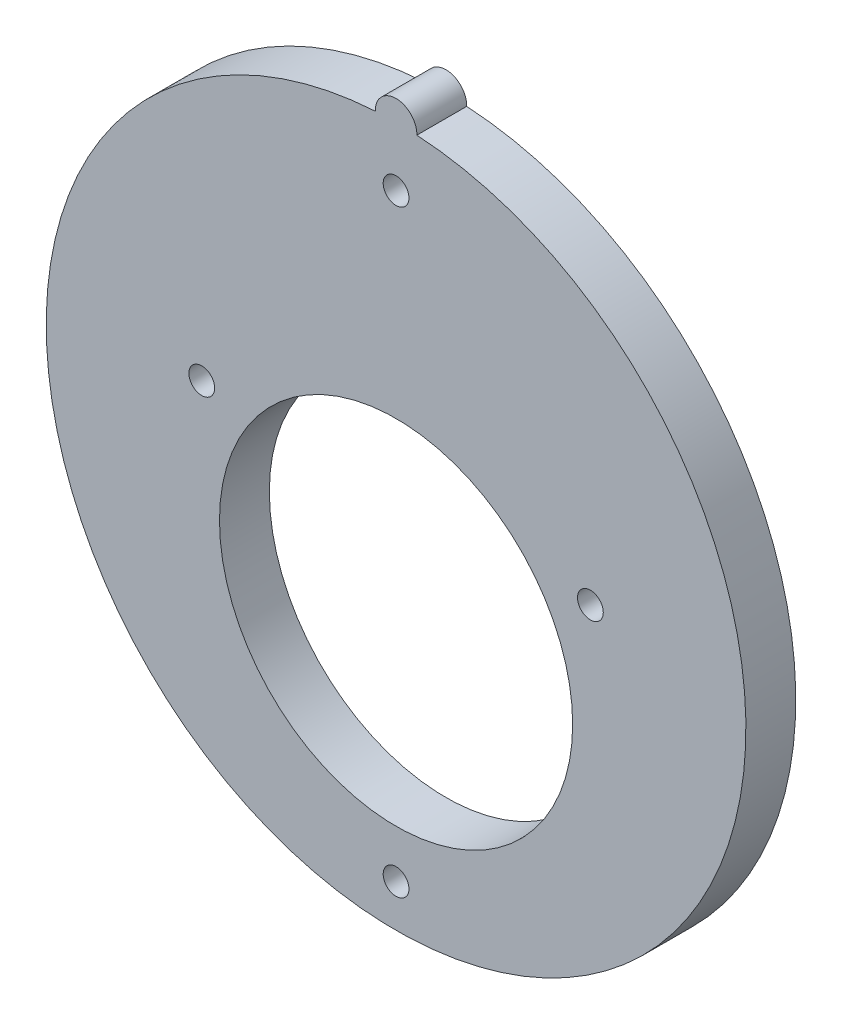
ISO-10303-21;
HEADER;
FILE_DESCRIPTION(('STEP AP214'),'2;1');
FILE_NAME('part.step','',(''),(''),'','','');
FILE_SCHEMA(('AUTOMOTIVE_DESIGN { 1 0 10303 214 1 1 1 1 }'));
ENDSEC;
DATA;
#1=APPLICATION_CONTEXT('core data for automotive mechanical design processes');
#2=APPLICATION_PROTOCOL_DEFINITION('international standard','automotive_design',2000,#1);
#3=PRODUCT_CONTEXT('',#1,'mechanical');
#4=PRODUCT('Part','Part','',(#3));
#5=PRODUCT_RELATED_PRODUCT_CATEGORY('part','',(#4));
#6=PRODUCT_DEFINITION_FORMATION('','',#4);
#7=PRODUCT_DEFINITION_CONTEXT('part definition',#1,'design');
#8=PRODUCT_DEFINITION('design','',#6,#7);
#9=PRODUCT_DEFINITION_SHAPE('','',#8);
#10=(LENGTH_UNIT() NAMED_UNIT(*) SI_UNIT(.MILLI.,.METRE.));
#11=(NAMED_UNIT(*) PLANE_ANGLE_UNIT() SI_UNIT($,.RADIAN.));
#12=(NAMED_UNIT(*) SI_UNIT($,.STERADIAN.) SOLID_ANGLE_UNIT());
#13=UNCERTAINTY_MEASURE_WITH_UNIT(LENGTH_MEASURE(1.E-05),#10,'distance_accuracy_value','');
#14=(GEOMETRIC_REPRESENTATION_CONTEXT(3) GLOBAL_UNCERTAINTY_ASSIGNED_CONTEXT((#13)) GLOBAL_UNIT_ASSIGNED_CONTEXT((#10,
#11,#12)) REPRESENTATION_CONTEXT('',''));
#15=CARTESIAN_POINT('',(0.,0.,0.));
#16=DIRECTION('',(0.,0.,1.));
#17=DIRECTION('',(1.,0.,0.));
#18=AXIS2_PLACEMENT_3D('',#15,#16,#17);
#19=CARTESIAN_POINT('',(41.2795138079787,73.9819791796727,6.));
#20=DIRECTION('',(0.,0.,-1.));
#21=DIRECTION('',(-1.,0.,0.));
#22=AXIS2_PLACEMENT_3D('',#19,#20,#21);
#23=CYLINDRICAL_SURFACE('',#22,2.5);
#24=CARTESIAN_POINT('',(41.2795138079787,73.9819791796727,0.));
#25=DIRECTION('',(0.,0.,1.));
#26=DIRECTION('',(1.,0.,0.));
#27=AXIS2_PLACEMENT_3D('',#24,#25,#26);
#28=CIRCLE('',#27,2.5);
#29=CARTESIAN_POINT('',(43.7784116049653,73.9077511511692,0.));
#30=VERTEX_POINT('',#29);
#31=CARTESIAN_POINT('',(38.7806160109921,73.9077511511692,0.));
#32=VERTEX_POINT('',#31);
#33=EDGE_CURVE('E67',#30,#32,#28,.T.);
#34=ORIENTED_EDGE('',*,*,#33,.T.);
#35=DIRECTION('',(0.,0.,-1.));
#36=VECTOR('',#35,1.);
#37=CARTESIAN_POINT('',(38.7806160109921,73.9077511511692,6.));
#38=LINE('',#37,#36);
#39=CARTESIAN_POINT('',(38.7806160109921,73.9077511511692,6.));
#40=VERTEX_POINT('',#39);
#41=EDGE_CURVE('E11',#40,#32,#38,.T.);
#42=ORIENTED_EDGE('',*,*,#41,.F.);
#43=CARTESIAN_POINT('',(41.2795138079787,73.9819791796727,6.));
#44=DIRECTION('',(0.,0.,1.));
#45=DIRECTION('',(1.,0.,0.));
#46=AXIS2_PLACEMENT_3D('',#43,#44,#45);
#47=CIRCLE('',#46,2.5);
#48=CARTESIAN_POINT('',(43.7784116049653,73.9077511511692,6.));
#49=VERTEX_POINT('',#48);
#50=EDGE_CURVE('E66',#49,#40,#47,.T.);
#51=ORIENTED_EDGE('',*,*,#50,.F.);
#52=DIRECTION('',(0.,0.,-1.));
#53=VECTOR('',#52,1.);
#54=CARTESIAN_POINT('',(43.7784116049653,73.9077511511692,6.));
#55=LINE('',#54,#53);
#56=EDGE_CURVE('E43',#49,#30,#55,.T.);
#57=ORIENTED_EDGE('',*,*,#56,.T.);
#58=EDGE_LOOP('',(#34,#42,#51,#57));
#59=FACE_BOUND('',#58,.T.);
#60=ADVANCED_FACE('F34',(#59),#23,.T.);
#61=CARTESIAN_POINT('',(41.2795138079787,31.8819791796727,6.));
#62=DIRECTION('',(0.,0.,-1.));
#63=DIRECTION('',(-1.,0.,0.));
#64=AXIS2_PLACEMENT_3D('',#61,#62,#63);
#65=CYLINDRICAL_SURFACE('',#64,42.1);
#66=CARTESIAN_POINT('',(41.2795138079787,31.8819791796727,0.));
#67=DIRECTION('',(0.,0.,1.));
#68=DIRECTION('',(1.,0.,0.));
#69=AXIS2_PLACEMENT_3D('',#66,#67,#68);
#70=CIRCLE('',#69,42.1);
#71=EDGE_CURVE('E59',#32,#30,#70,.T.);
#72=ORIENTED_EDGE('',*,*,#71,.T.);
#73=ORIENTED_EDGE('',*,*,#56,.F.);
#74=CARTESIAN_POINT('',(41.2795138079787,31.8819791796727,6.));
#75=DIRECTION('',(0.,0.,1.));
#76=DIRECTION('',(1.,0.,0.));
#77=AXIS2_PLACEMENT_3D('',#74,#75,#76);
#78=CIRCLE('',#77,42.1);
#79=EDGE_CURVE('E51',#40,#49,#78,.T.);
#80=ORIENTED_EDGE('',*,*,#79,.F.);
#81=ORIENTED_EDGE('',*,*,#41,.T.);
#82=EDGE_LOOP('',(#72,#73,#80,#81));
#83=FACE_BOUND('',#82,.T.);
#84=ADVANCED_FACE('F62',(#83),#65,.T.);
#85=CARTESIAN_POINT('',(41.2795138079787,52.9319791796727,6.));
#86=DIRECTION('',(0.,0.,1.));
#87=DIRECTION('',(1.,0.,0.));
#88=AXIS2_PLACEMENT_3D('',#85,#86,#87);
#89=PLANE('',#88);
#90=CARTESIAN_POINT('',(41.2795138079787,66.8819791796727,6.));
#91=DIRECTION('',(0.,0.,1.));
#92=DIRECTION('',(1.,0.,0.));
#93=AXIS2_PLACEMENT_3D('',#90,#91,#92);
#94=CIRCLE('',#93,1.55);
#95=CARTESIAN_POINT('',(42.8295138079787,66.8819791796727,6.));
#96=VERTEX_POINT('',#95);
#97=EDGE_CURVE('E99',#96,#96,#94,.T.);
#98=ORIENTED_EDGE('',*,*,#97,.F.);
#99=EDGE_LOOP('',(#98));
#100=FACE_BOUND('',#99,.T.);
#101=CARTESIAN_POINT('',(64.6621997101586,35.3819791796727,6.));
#102=DIRECTION('',(0.,0.,1.));
#103=DIRECTION('',(1.,0.,0.));
#104=AXIS2_PLACEMENT_3D('',#101,#102,#103);
#105=CIRCLE('',#104,1.54999999999999);
#106=CARTESIAN_POINT('',(66.2121997101586,35.3819791796727,6.));
#107=VERTEX_POINT('',#106);
#108=EDGE_CURVE('E89',#107,#107,#105,.T.);
#109=ORIENTED_EDGE('',*,*,#108,.F.);
#110=EDGE_LOOP('',(#109));
#111=FACE_BOUND('',#110,.T.);
#112=CARTESIAN_POINT('',(17.8968279057989,35.3819791796728,6.));
#113=DIRECTION('',(0.,0.,1.));
#114=DIRECTION('',(1.,0.,0.));
#115=AXIS2_PLACEMENT_3D('',#112,#113,#114);
#116=CIRCLE('',#115,1.55);
#117=CARTESIAN_POINT('',(19.4468279057989,35.3819791796728,6.));
#118=VERTEX_POINT('',#117);
#119=EDGE_CURVE('E86',#118,#118,#116,.T.);
#120=ORIENTED_EDGE('',*,*,#119,.F.);
#121=EDGE_LOOP('',(#120));
#122=FACE_BOUND('',#121,.T.);
#123=CARTESIAN_POINT('',(41.2795138079787,-5.11802082032728,6.));
#124=DIRECTION('',(0.,0.,1.));
#125=DIRECTION('',(1.,0.,0.));
#126=AXIS2_PLACEMENT_3D('',#123,#124,#125);
#127=CIRCLE('',#126,1.55);
#128=CARTESIAN_POINT('',(42.8295138079787,-5.11802082032728,6.));
#129=VERTEX_POINT('',#128);
#130=EDGE_CURVE('E83',#129,#129,#127,.T.);
#131=ORIENTED_EDGE('',*,*,#130,.F.);
#132=EDGE_LOOP('',(#131));
#133=FACE_BOUND('',#132,.T.);
#134=CARTESIAN_POINT('',(41.2795138079787,21.8819791796727,6.));
#135=DIRECTION('',(0.,0.,1.));
#136=DIRECTION('',(1.,0.,0.));
#137=AXIS2_PLACEMENT_3D('',#134,#135,#136);
#138=CIRCLE('',#137,21.25);
#139=CARTESIAN_POINT('',(62.5295138079787,21.8819791796727,6.));
#140=VERTEX_POINT('',#139);
#141=EDGE_CURVE('E75',#140,#140,#138,.T.);
#142=ORIENTED_EDGE('',*,*,#141,.F.);
#143=EDGE_LOOP('',(#142));
#144=FACE_BOUND('',#143,.T.);
#145=ORIENTED_EDGE('',*,*,#50,.T.);
#146=ORIENTED_EDGE('',*,*,#79,.T.);
#147=EDGE_LOOP('',(#145,#146));
#148=FACE_BOUND('',#147,.T.);
#149=ADVANCED_FACE('F105',(#100,#111,#122,#133,#144,#148),#89,.T.);
#150=CARTESIAN_POINT('',(41.2795138079787,52.9319791796727,0.));
#151=DIRECTION('',(0.,0.,1.));
#152=DIRECTION('',(1.,0.,0.));
#153=AXIS2_PLACEMENT_3D('',#150,#151,#152);
#154=PLANE('',#153);
#155=CARTESIAN_POINT('',(41.2795138079787,66.8819791796727,0.));
#156=DIRECTION('',(0.,0.,1.));
#157=DIRECTION('',(1.,0.,0.));
#158=AXIS2_PLACEMENT_3D('',#155,#156,#157);
#159=CIRCLE('',#158,1.55);
#160=CARTESIAN_POINT('',(42.8295138079787,66.8819791796727,0.));
#161=VERTEX_POINT('',#160);
#162=EDGE_CURVE('E37',#161,#161,#159,.T.);
#163=ORIENTED_EDGE('',*,*,#162,.T.);
#164=EDGE_LOOP('',(#163));
#165=FACE_BOUND('',#164,.T.);
#166=CARTESIAN_POINT('',(64.6621997101586,35.3819791796727,0.));
#167=DIRECTION('',(0.,0.,1.));
#168=DIRECTION('',(1.,0.,0.));
#169=AXIS2_PLACEMENT_3D('',#166,#167,#168);
#170=CIRCLE('',#169,1.54999999999999);
#171=CARTESIAN_POINT('',(66.2121997101586,35.3819791796727,0.));
#172=VERTEX_POINT('',#171);
#173=EDGE_CURVE('E87',#172,#172,#170,.T.);
#174=ORIENTED_EDGE('',*,*,#173,.T.);
#175=EDGE_LOOP('',(#174));
#176=FACE_BOUND('',#175,.T.);
#177=CARTESIAN_POINT('',(17.8968279057989,35.3819791796728,0.));
#178=DIRECTION('',(0.,0.,1.));
#179=DIRECTION('',(1.,0.,0.));
#180=AXIS2_PLACEMENT_3D('',#177,#178,#179);
#181=CIRCLE('',#180,1.55);
#182=CARTESIAN_POINT('',(19.4468279057989,35.3819791796728,0.));
#183=VERTEX_POINT('',#182);
#184=EDGE_CURVE('E84',#183,#183,#181,.T.);
#185=ORIENTED_EDGE('',*,*,#184,.T.);
#186=EDGE_LOOP('',(#185));
#187=FACE_BOUND('',#186,.T.);
#188=CARTESIAN_POINT('',(41.2795138079787,-5.11802082032728,0.));
#189=DIRECTION('',(0.,0.,1.));
#190=DIRECTION('',(1.,0.,0.));
#191=AXIS2_PLACEMENT_3D('',#188,#189,#190);
#192=CIRCLE('',#191,1.55);
#193=CARTESIAN_POINT('',(42.8295138079787,-5.11802082032728,0.));
#194=VERTEX_POINT('',#193);
#195=EDGE_CURVE('E80',#194,#194,#192,.T.);
#196=ORIENTED_EDGE('',*,*,#195,.T.);
#197=EDGE_LOOP('',(#196));
#198=FACE_BOUND('',#197,.T.);
#199=CARTESIAN_POINT('',(41.2795138079787,21.8819791796727,0.));
#200=DIRECTION('',(0.,0.,1.));
#201=DIRECTION('',(1.,0.,0.));
#202=AXIS2_PLACEMENT_3D('',#199,#200,#201);
#203=CIRCLE('',#202,21.25);
#204=CARTESIAN_POINT('',(62.5295138079787,21.8819791796727,0.));
#205=VERTEX_POINT('',#204);
#206=EDGE_CURVE('E72',#205,#205,#203,.T.);
#207=ORIENTED_EDGE('',*,*,#206,.T.);
#208=EDGE_LOOP('',(#207));
#209=FACE_BOUND('',#208,.T.);
#210=ORIENTED_EDGE('',*,*,#33,.F.);
#211=ORIENTED_EDGE('',*,*,#71,.F.);
#212=EDGE_LOOP('',(#210,#211));
#213=FACE_BOUND('',#212,.T.);
#214=ADVANCED_FACE('F71',(#165,#176,#187,#198,#209,#213),#154,.F.);
#215=CARTESIAN_POINT('',(41.2795138079787,21.8819791796727,-4.));
#216=DIRECTION('',(0.,0.,1.));
#217=DIRECTION('',(1.,0.,0.));
#218=AXIS2_PLACEMENT_3D('',#215,#216,#217);
#219=CYLINDRICAL_SURFACE('',#218,21.25);
#220=ORIENTED_EDGE('',*,*,#141,.T.);
#221=EDGE_LOOP('',(#220));
#222=FACE_BOUND('',#221,.T.);
#223=ORIENTED_EDGE('',*,*,#206,.F.);
#224=EDGE_LOOP('',(#223));
#225=FACE_BOUND('',#224,.T.);
#226=ADVANCED_FACE('F113',(#222,#225),#219,.F.);
#227=CARTESIAN_POINT('',(41.2795138079787,-5.11802082032728,-4.));
#228=DIRECTION('',(0.,0.,1.));
#229=DIRECTION('',(1.,0.,0.));
#230=AXIS2_PLACEMENT_3D('',#227,#228,#229);
#231=CYLINDRICAL_SURFACE('',#230,1.55);
#232=ORIENTED_EDGE('',*,*,#130,.T.);
#233=EDGE_LOOP('',(#232));
#234=FACE_BOUND('',#233,.T.);
#235=ORIENTED_EDGE('',*,*,#195,.F.);
#236=EDGE_LOOP('',(#235));
#237=FACE_BOUND('',#236,.T.);
#238=ADVANCED_FACE('F135',(#234,#237),#231,.F.);
#239=CARTESIAN_POINT('',(17.8968279057989,35.3819791796728,-4.));
#240=DIRECTION('',(0.,0.,1.));
#241=DIRECTION('',(1.,0.,0.));
#242=AXIS2_PLACEMENT_3D('',#239,#240,#241);
#243=CYLINDRICAL_SURFACE('',#242,1.55);
#244=ORIENTED_EDGE('',*,*,#119,.T.);
#245=EDGE_LOOP('',(#244));
#246=FACE_BOUND('',#245,.T.);
#247=ORIENTED_EDGE('',*,*,#184,.F.);
#248=EDGE_LOOP('',(#247));
#249=FACE_BOUND('',#248,.T.);
#250=ADVANCED_FACE('F154',(#246,#249),#243,.F.);
#251=CARTESIAN_POINT('',(64.6621997101586,35.3819791796727,-4.));
#252=DIRECTION('',(0.,0.,1.));
#253=DIRECTION('',(1.,0.,0.));
#254=AXIS2_PLACEMENT_3D('',#251,#252,#253);
#255=CYLINDRICAL_SURFACE('',#254,1.54999999999999);
#256=ORIENTED_EDGE('',*,*,#108,.T.);
#257=EDGE_LOOP('',(#256));
#258=FACE_BOUND('',#257,.T.);
#259=ORIENTED_EDGE('',*,*,#173,.F.);
#260=EDGE_LOOP('',(#259));
#261=FACE_BOUND('',#260,.T.);
#262=ADVANCED_FACE('F164',(#258,#261),#255,.F.);
#263=CARTESIAN_POINT('',(41.2795138079787,66.8819791796727,-4.));
#264=DIRECTION('',(0.,0.,1.));
#265=DIRECTION('',(1.,0.,0.));
#266=AXIS2_PLACEMENT_3D('',#263,#264,#265);
#267=CYLINDRICAL_SURFACE('',#266,1.55);
#268=ORIENTED_EDGE('',*,*,#97,.T.);
#269=EDGE_LOOP('',(#268));
#270=FACE_BOUND('',#269,.T.);
#271=ORIENTED_EDGE('',*,*,#162,.F.);
#272=EDGE_LOOP('',(#271));
#273=FACE_BOUND('',#272,.T.);
#274=ADVANCED_FACE('F174',(#270,#273),#267,.F.);
#275=CLOSED_SHELL('',(#60,#84,#149,#214,#226,#238,#250,#262,#274));
#276=MANIFOLD_SOLID_BREP('B2',#275);
#277=ADVANCED_BREP_SHAPE_REPRESENTATION('',(#18,#276),#14);
#278=SHAPE_DEFINITION_REPRESENTATION(#9,#277);
ENDSEC;
END-ISO-10303-21;
